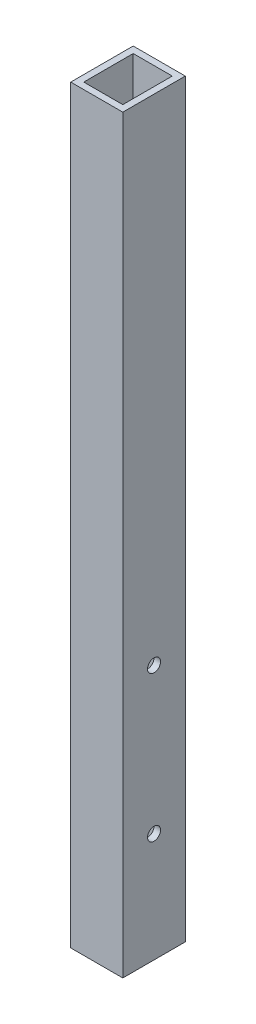
ISO-10303-21;
HEADER;
FILE_DESCRIPTION(('STEP AP214'),'2;1');
FILE_NAME('part.step','',(''),(''),'','','');
FILE_SCHEMA(('AUTOMOTIVE_DESIGN { 1 0 10303 214 1 1 1 1 }'));
ENDSEC;
DATA;
#1=APPLICATION_CONTEXT('core data for automotive mechanical design processes');
#2=APPLICATION_PROTOCOL_DEFINITION('international standard','automotive_design',2000,#1);
#3=PRODUCT_CONTEXT('',#1,'mechanical');
#4=PRODUCT('Part','Part','',(#3));
#5=PRODUCT_RELATED_PRODUCT_CATEGORY('part','',(#4));
#6=PRODUCT_DEFINITION_FORMATION('','',#4);
#7=PRODUCT_DEFINITION_CONTEXT('part definition',#1,'design');
#8=PRODUCT_DEFINITION('design','',#6,#7);
#9=PRODUCT_DEFINITION_SHAPE('','',#8);
#10=(LENGTH_UNIT() NAMED_UNIT(*) SI_UNIT(.MILLI.,.METRE.));
#11=(NAMED_UNIT(*) PLANE_ANGLE_UNIT() SI_UNIT($,.RADIAN.));
#12=(NAMED_UNIT(*) SI_UNIT($,.STERADIAN.) SOLID_ANGLE_UNIT());
#13=UNCERTAINTY_MEASURE_WITH_UNIT(LENGTH_MEASURE(1.E-05),#10,'distance_accuracy_value','');
#14=(GEOMETRIC_REPRESENTATION_CONTEXT(3) GLOBAL_UNCERTAINTY_ASSIGNED_CONTEXT((#13)) GLOBAL_UNIT_ASSIGNED_CONTEXT((#10,
#11,#12)) REPRESENTATION_CONTEXT('',''));
#15=CARTESIAN_POINT('',(0.,0.,0.));
#16=DIRECTION('',(0.,0.,1.));
#17=DIRECTION('',(1.,0.,0.));
#18=AXIS2_PLACEMENT_3D('',#15,#16,#17);
#19=CARTESIAN_POINT('',(31.75,914.4,38.1));
#20=DIRECTION('',(-1.,0.,0.));
#21=DIRECTION('',(0.,0.,1.));
#22=AXIS2_PLACEMENT_3D('',#19,#20,#21);
#23=PLANE('',#22);
#24=CARTESIAN_POINT('',(31.75,311.15,0.));
#25=DIRECTION('',(1.,0.,0.));
#26=DIRECTION('',(0.,0.,-1.));
#27=AXIS2_PLACEMENT_3D('',#24,#25,#26);
#28=CIRCLE('',#27,7.93749999999999);
#29=CARTESIAN_POINT('',(31.75,311.15,-7.93749999999999));
#30=VERTEX_POINT('',#29);
#31=EDGE_CURVE('E206',#30,#30,#28,.T.);
#32=ORIENTED_EDGE('',*,*,#31,.F.);
#33=EDGE_LOOP('',(#32));
#34=FACE_BOUND('',#33,.T.);
#35=CARTESIAN_POINT('',(31.75,133.35,0.));
#36=DIRECTION('',(1.,0.,0.));
#37=DIRECTION('',(0.,0.,-1.));
#38=AXIS2_PLACEMENT_3D('',#35,#36,#37);
#39=CIRCLE('',#38,7.93749999999999);
#40=CARTESIAN_POINT('',(31.75,133.35,-7.93749999999999));
#41=VERTEX_POINT('',#40);
#42=EDGE_CURVE('E218',#41,#41,#39,.T.);
#43=ORIENTED_EDGE('',*,*,#42,.F.);
#44=EDGE_LOOP('',(#43));
#45=FACE_BOUND('',#44,.T.);
#46=DIRECTION('',(0.,0.,-1.));
#47=VECTOR('',#46,1.);
#48=CARTESIAN_POINT('',(31.75,0.,38.1));
#49=LINE('',#48,#47);
#50=CARTESIAN_POINT('',(31.75,0.,38.1));
#51=VERTEX_POINT('',#50);
#52=CARTESIAN_POINT('',(31.75,0.,-38.1));
#53=VERTEX_POINT('',#52);
#54=EDGE_CURVE('E154',#51,#53,#49,.T.);
#55=ORIENTED_EDGE('',*,*,#54,.T.);
#56=DIRECTION('',(0.,-1.,0.));
#57=VECTOR('',#56,1.);
#58=CARTESIAN_POINT('',(31.75,914.4,-38.1));
#59=LINE('',#58,#57);
#60=CARTESIAN_POINT('',(31.75,914.4,-38.1));
#61=VERTEX_POINT('',#60);
#62=EDGE_CURVE('E11',#61,#53,#59,.T.);
#63=ORIENTED_EDGE('',*,*,#62,.F.);
#64=DIRECTION('',(0.,0.,-1.));
#65=VECTOR('',#64,1.);
#66=CARTESIAN_POINT('',(31.75,914.4,38.1));
#67=LINE('',#66,#65);
#68=CARTESIAN_POINT('',(31.75,914.4,38.1));
#69=VERTEX_POINT('',#68);
#70=EDGE_CURVE('E160',#69,#61,#67,.T.);
#71=ORIENTED_EDGE('',*,*,#70,.F.);
#72=DIRECTION('',(0.,-1.,0.));
#73=VECTOR('',#72,1.);
#74=CARTESIAN_POINT('',(31.75,914.4,38.1));
#75=LINE('',#74,#73);
#76=EDGE_CURVE('E174',#69,#51,#75,.T.);
#77=ORIENTED_EDGE('',*,*,#76,.T.);
#78=EDGE_LOOP('',(#55,#63,#71,#77));
#79=FACE_BOUND('',#78,.T.);
#80=ADVANCED_FACE('F41',(#34,#45,#79),#23,.F.);
#81=CARTESIAN_POINT('',(-31.75,914.4,-38.1));
#82=DIRECTION('',(0.,0.,1.));
#83=DIRECTION('',(1.,0.,0.));
#84=AXIS2_PLACEMENT_3D('',#81,#82,#83);
#85=PLANE('',#84);
#86=DIRECTION('',(-1.,0.,0.));
#87=VECTOR('',#86,1.);
#88=CARTESIAN_POINT('',(-31.75,0.,-38.1));
#89=LINE('',#88,#87);
#90=CARTESIAN_POINT('',(-31.75,0.,-38.1));
#91=VERTEX_POINT('',#90);
#92=EDGE_CURVE('E178',#53,#91,#89,.T.);
#93=ORIENTED_EDGE('',*,*,#92,.T.);
#94=DIRECTION('',(0.,-1.,0.));
#95=VECTOR('',#94,1.);
#96=CARTESIAN_POINT('',(-31.75,914.4,-38.1));
#97=LINE('',#96,#95);
#98=CARTESIAN_POINT('',(-31.75,914.4,-38.1));
#99=VERTEX_POINT('',#98);
#100=EDGE_CURVE('E50',#99,#91,#97,.T.);
#101=ORIENTED_EDGE('',*,*,#100,.F.);
#102=DIRECTION('',(-1.,0.,0.));
#103=VECTOR('',#102,1.);
#104=CARTESIAN_POINT('',(-31.75,914.4,-38.1));
#105=LINE('',#104,#103);
#106=EDGE_CURVE('E164',#61,#99,#105,.T.);
#107=ORIENTED_EDGE('',*,*,#106,.F.);
#108=ORIENTED_EDGE('',*,*,#62,.T.);
#109=EDGE_LOOP('',(#93,#101,#107,#108));
#110=FACE_BOUND('',#109,.T.);
#111=ADVANCED_FACE('F228',(#110),#85,.F.);
#112=CARTESIAN_POINT('',(-31.75,914.4,38.1));
#113=DIRECTION('',(1.,0.,0.));
#114=DIRECTION('',(0.,0.,-1.));
#115=AXIS2_PLACEMENT_3D('',#112,#113,#114);
#116=PLANE('',#115);
#117=CARTESIAN_POINT('',(-31.75,311.15,0.));
#118=DIRECTION('',(1.,0.,0.));
#119=DIRECTION('',(0.,0.,-1.));
#120=AXIS2_PLACEMENT_3D('',#117,#118,#119);
#121=CIRCLE('',#120,7.93749999999999);
#122=CARTESIAN_POINT('',(-31.75,311.15,-7.93749999999999));
#123=VERTEX_POINT('',#122);
#124=EDGE_CURVE('E199',#123,#123,#121,.T.);
#125=ORIENTED_EDGE('',*,*,#124,.T.);
#126=EDGE_LOOP('',(#125));
#127=FACE_BOUND('',#126,.T.);
#128=CARTESIAN_POINT('',(-31.75,133.35,0.));
#129=DIRECTION('',(1.,0.,0.));
#130=DIRECTION('',(0.,0.,-1.));
#131=AXIS2_PLACEMENT_3D('',#128,#129,#130);
#132=CIRCLE('',#131,7.93749999999999);
#133=CARTESIAN_POINT('',(-31.75,133.35,-7.93749999999999));
#134=VERTEX_POINT('',#133);
#135=EDGE_CURVE('E212',#134,#134,#132,.T.);
#136=ORIENTED_EDGE('',*,*,#135,.T.);
#137=EDGE_LOOP('',(#136));
#138=FACE_BOUND('',#137,.T.);
#139=DIRECTION('',(0.,0.,1.));
#140=VECTOR('',#139,1.);
#141=CARTESIAN_POINT('',(-31.75,0.,38.1));
#142=LINE('',#141,#140);
#143=CARTESIAN_POINT('',(-31.75,0.,38.1));
#144=VERTEX_POINT('',#143);
#145=EDGE_CURVE('E181',#91,#144,#142,.T.);
#146=ORIENTED_EDGE('',*,*,#145,.T.);
#147=DIRECTION('',(0.,-1.,0.));
#148=VECTOR('',#147,1.);
#149=CARTESIAN_POINT('',(-31.75,914.4,38.1));
#150=LINE('',#149,#148);
#151=CARTESIAN_POINT('',(-31.75,914.4,38.1));
#152=VERTEX_POINT('',#151);
#153=EDGE_CURVE('E189',#152,#144,#150,.T.);
#154=ORIENTED_EDGE('',*,*,#153,.F.);
#155=DIRECTION('',(0.,0.,1.));
#156=VECTOR('',#155,1.);
#157=CARTESIAN_POINT('',(-31.75,914.4,38.1));
#158=LINE('',#157,#156);
#159=EDGE_CURVE('E168',#99,#152,#158,.T.);
#160=ORIENTED_EDGE('',*,*,#159,.F.);
#161=ORIENTED_EDGE('',*,*,#100,.T.);
#162=EDGE_LOOP('',(#146,#154,#160,#161));
#163=FACE_BOUND('',#162,.T.);
#164=ADVANCED_FACE('F246',(#127,#138,#163),#116,.F.);
#165=CARTESIAN_POINT('',(-31.75,914.4,38.1));
#166=DIRECTION('',(0.,0.,-1.));
#167=DIRECTION('',(-1.,0.,0.));
#168=AXIS2_PLACEMENT_3D('',#165,#166,#167);
#169=PLANE('',#168);
#170=DIRECTION('',(1.,0.,0.));
#171=VECTOR('',#170,1.);
#172=CARTESIAN_POINT('',(-31.75,0.,38.1));
#173=LINE('',#172,#171);
#174=EDGE_CURVE('E165',#144,#51,#173,.T.);
#175=ORIENTED_EDGE('',*,*,#174,.T.);
#176=ORIENTED_EDGE('',*,*,#76,.F.);
#177=DIRECTION('',(1.,0.,0.));
#178=VECTOR('',#177,1.);
#179=CARTESIAN_POINT('',(-31.75,914.4,38.1));
#180=LINE('',#179,#178);
#181=EDGE_CURVE('E171',#152,#69,#180,.T.);
#182=ORIENTED_EDGE('',*,*,#181,.F.);
#183=ORIENTED_EDGE('',*,*,#153,.T.);
#184=EDGE_LOOP('',(#175,#176,#182,#183));
#185=FACE_BOUND('',#184,.T.);
#186=ADVANCED_FACE('F244',(#185),#169,.F.);
#187=CARTESIAN_POINT('',(0.,914.4,0.));
#188=DIRECTION('',(0.,-1.,0.));
#189=DIRECTION('',(0.,0.,-1.));
#190=AXIS2_PLACEMENT_3D('',#187,#188,#189);
#191=PLANE('',#190);
#192=DIRECTION('',(-1.,0.,0.));
#193=VECTOR('',#192,1.);
#194=CARTESIAN_POINT('',(-23.8125,914.4,-30.1625));
#195=LINE('',#194,#193);
#196=CARTESIAN_POINT('',(23.8125,914.4,-30.1625));
#197=VERTEX_POINT('',#196);
#198=CARTESIAN_POINT('',(-23.8125,914.4,-30.1625));
#199=VERTEX_POINT('',#198);
#200=EDGE_CURVE('E145',#197,#199,#195,.T.);
#201=ORIENTED_EDGE('',*,*,#200,.F.);
#202=DIRECTION('',(0.,0.,-1.));
#203=VECTOR('',#202,1.);
#204=CARTESIAN_POINT('',(23.8125,914.4,30.1625));
#205=LINE('',#204,#203);
#206=CARTESIAN_POINT('',(23.8125,914.4,30.1625));
#207=VERTEX_POINT('',#206);
#208=EDGE_CURVE('E58',#207,#197,#205,.T.);
#209=ORIENTED_EDGE('',*,*,#208,.F.);
#210=DIRECTION('',(1.,0.,0.));
#211=VECTOR('',#210,1.);
#212=CARTESIAN_POINT('',(-23.8125,914.4,30.1625));
#213=LINE('',#212,#211);
#214=CARTESIAN_POINT('',(-23.8125,914.4,30.1625));
#215=VERTEX_POINT('',#214);
#216=EDGE_CURVE('E129',#215,#207,#213,.T.);
#217=ORIENTED_EDGE('',*,*,#216,.F.);
#218=DIRECTION('',(0.,0.,1.));
#219=VECTOR('',#218,1.);
#220=CARTESIAN_POINT('',(-23.8125,914.4,30.1625));
#221=LINE('',#220,#219);
#222=EDGE_CURVE('E133',#199,#215,#221,.T.);
#223=ORIENTED_EDGE('',*,*,#222,.F.);
#224=EDGE_LOOP('',(#201,#209,#217,#223));
#225=FACE_BOUND('',#224,.T.);
#226=ORIENTED_EDGE('',*,*,#70,.T.);
#227=ORIENTED_EDGE('',*,*,#106,.T.);
#228=ORIENTED_EDGE('',*,*,#159,.T.);
#229=ORIENTED_EDGE('',*,*,#181,.T.);
#230=EDGE_LOOP('',(#226,#227,#228,#229));
#231=FACE_BOUND('',#230,.T.);
#232=ADVANCED_FACE('F240',(#225,#231),#191,.F.);
#233=CARTESIAN_POINT('',(0.,0.,0.));
#234=DIRECTION('',(0.,-1.,0.));
#235=DIRECTION('',(0.,0.,-1.));
#236=AXIS2_PLACEMENT_3D('',#233,#234,#235);
#237=PLANE('',#236);
#238=DIRECTION('',(0.,0.,-1.));
#239=VECTOR('',#238,1.);
#240=CARTESIAN_POINT('',(23.8125,0.,30.1625));
#241=LINE('',#240,#239);
#242=CARTESIAN_POINT('',(23.8125,0.,30.1625));
#243=VERTEX_POINT('',#242);
#244=CARTESIAN_POINT('',(23.8125,0.,-30.1625));
#245=VERTEX_POINT('',#244);
#246=EDGE_CURVE('E110',#243,#245,#241,.T.);
#247=ORIENTED_EDGE('',*,*,#246,.T.);
#248=DIRECTION('',(-1.,0.,0.));
#249=VECTOR('',#248,1.);
#250=CARTESIAN_POINT('',(-23.8125,0.,-30.1625));
#251=LINE('',#250,#249);
#252=CARTESIAN_POINT('',(-23.8125,0.,-30.1625));
#253=VERTEX_POINT('',#252);
#254=EDGE_CURVE('E120',#245,#253,#251,.T.);
#255=ORIENTED_EDGE('',*,*,#254,.T.);
#256=DIRECTION('',(0.,0.,1.));
#257=VECTOR('',#256,1.);
#258=CARTESIAN_POINT('',(-23.8125,0.,30.1625));
#259=LINE('',#258,#257);
#260=CARTESIAN_POINT('',(-23.8125,0.,30.1625));
#261=VERTEX_POINT('',#260);
#262=EDGE_CURVE('E66',#253,#261,#259,.T.);
#263=ORIENTED_EDGE('',*,*,#262,.T.);
#264=DIRECTION('',(1.,0.,0.));
#265=VECTOR('',#264,1.);
#266=CARTESIAN_POINT('',(-23.8125,0.,30.1625));
#267=LINE('',#266,#265);
#268=EDGE_CURVE('E117',#261,#243,#267,.T.);
#269=ORIENTED_EDGE('',*,*,#268,.T.);
#270=EDGE_LOOP('',(#247,#255,#263,#269));
#271=FACE_BOUND('',#270,.T.);
#272=ORIENTED_EDGE('',*,*,#54,.F.);
#273=ORIENTED_EDGE('',*,*,#174,.F.);
#274=ORIENTED_EDGE('',*,*,#145,.F.);
#275=ORIENTED_EDGE('',*,*,#92,.F.);
#276=EDGE_LOOP('',(#272,#273,#274,#275));
#277=FACE_BOUND('',#276,.T.);
#278=ADVANCED_FACE('F125',(#271,#277),#237,.T.);
#279=CARTESIAN_POINT('',(23.8125,0.,30.1625));
#280=DIRECTION('',(1.,0.,0.));
#281=DIRECTION('',(0.,0.,-1.));
#282=AXIS2_PLACEMENT_3D('',#279,#280,#281);
#283=PLANE('',#282);
#284=CARTESIAN_POINT('',(23.8125,311.15,0.));
#285=DIRECTION('',(1.,0.,0.));
#286=DIRECTION('',(0.,0.,-1.));
#287=AXIS2_PLACEMENT_3D('',#284,#285,#286);
#288=CIRCLE('',#287,7.93749999999999);
#289=CARTESIAN_POINT('',(23.8125,311.15,-7.93749999999999));
#290=VERTEX_POINT('',#289);
#291=EDGE_CURVE('E136',#290,#290,#288,.T.);
#292=ORIENTED_EDGE('',*,*,#291,.T.);
#293=EDGE_LOOP('',(#292));
#294=FACE_BOUND('',#293,.T.);
#295=CARTESIAN_POINT('',(23.8125,133.35,0.));
#296=DIRECTION('',(1.,0.,0.));
#297=DIRECTION('',(0.,0.,-1.));
#298=AXIS2_PLACEMENT_3D('',#295,#296,#297);
#299=CIRCLE('',#298,7.93749999999999);
#300=CARTESIAN_POINT('',(23.8125,133.35,-7.93749999999999));
#301=VERTEX_POINT('',#300);
#302=EDGE_CURVE('E198',#301,#301,#299,.T.);
#303=ORIENTED_EDGE('',*,*,#302,.T.);
#304=EDGE_LOOP('',(#303));
#305=FACE_BOUND('',#304,.T.);
#306=ORIENTED_EDGE('',*,*,#208,.T.);
#307=DIRECTION('',(0.,1.,0.));
#308=VECTOR('',#307,1.);
#309=CARTESIAN_POINT('',(23.8125,0.,-30.1625));
#310=LINE('',#309,#308);
#311=EDGE_CURVE('E106',#245,#197,#310,.T.);
#312=ORIENTED_EDGE('',*,*,#311,.F.);
#313=ORIENTED_EDGE('',*,*,#246,.F.);
#314=DIRECTION('',(0.,1.,0.));
#315=VECTOR('',#314,1.);
#316=CARTESIAN_POINT('',(23.8125,0.,30.1625));
#317=LINE('',#316,#315);
#318=EDGE_CURVE('E151',#243,#207,#317,.T.);
#319=ORIENTED_EDGE('',*,*,#318,.T.);
#320=EDGE_LOOP('',(#306,#312,#313,#319));
#321=FACE_BOUND('',#320,.T.);
#322=ADVANCED_FACE('F108',(#294,#305,#321),#283,.F.);
#323=CARTESIAN_POINT('',(-23.8125,0.,30.1625));
#324=DIRECTION('',(0.,0.,1.));
#325=DIRECTION('',(1.,0.,0.));
#326=AXIS2_PLACEMENT_3D('',#323,#324,#325);
#327=PLANE('',#326);
#328=ORIENTED_EDGE('',*,*,#216,.T.);
#329=ORIENTED_EDGE('',*,*,#318,.F.);
#330=ORIENTED_EDGE('',*,*,#268,.F.);
#331=DIRECTION('',(0.,1.,0.));
#332=VECTOR('',#331,1.);
#333=CARTESIAN_POINT('',(-23.8125,0.,30.1625));
#334=LINE('',#333,#332);
#335=EDGE_CURVE('E155',#261,#215,#334,.T.);
#336=ORIENTED_EDGE('',*,*,#335,.T.);
#337=EDGE_LOOP('',(#328,#329,#330,#336));
#338=FACE_BOUND('',#337,.T.);
#339=ADVANCED_FACE('F263',(#338),#327,.F.);
#340=CARTESIAN_POINT('',(-23.8125,0.,30.1625));
#341=DIRECTION('',(-1.,0.,0.));
#342=DIRECTION('',(0.,0.,1.));
#343=AXIS2_PLACEMENT_3D('',#340,#341,#342);
#344=PLANE('',#343);
#345=CARTESIAN_POINT('',(-23.8125,311.15,0.));
#346=DIRECTION('',(-1.,0.,0.));
#347=DIRECTION('',(0.,0.,1.));
#348=AXIS2_PLACEMENT_3D('',#345,#346,#347);
#349=CIRCLE('',#348,7.93749999999999);
#350=CARTESIAN_POINT('',(-23.8125,311.15,7.93749999999999));
#351=VERTEX_POINT('',#350);
#352=EDGE_CURVE('E44',#351,#351,#349,.T.);
#353=ORIENTED_EDGE('',*,*,#352,.T.);
#354=EDGE_LOOP('',(#353));
#355=FACE_BOUND('',#354,.T.);
#356=CARTESIAN_POINT('',(-23.8125,133.35,0.));
#357=DIRECTION('',(-1.,0.,0.));
#358=DIRECTION('',(0.,0.,1.));
#359=AXIS2_PLACEMENT_3D('',#356,#357,#358);
#360=CIRCLE('',#359,7.93749999999999);
#361=CARTESIAN_POINT('',(-23.8125,133.35,7.93749999999999));
#362=VERTEX_POINT('',#361);
#363=EDGE_CURVE('E195',#362,#362,#360,.T.);
#364=ORIENTED_EDGE('',*,*,#363,.T.);
#365=EDGE_LOOP('',(#364));
#366=FACE_BOUND('',#365,.T.);
#367=ORIENTED_EDGE('',*,*,#222,.T.);
#368=ORIENTED_EDGE('',*,*,#335,.F.);
#369=ORIENTED_EDGE('',*,*,#262,.F.);
#370=DIRECTION('',(0.,1.,0.));
#371=VECTOR('',#370,1.);
#372=CARTESIAN_POINT('',(-23.8125,0.,-30.1625));
#373=LINE('',#372,#371);
#374=EDGE_CURVE('E116',#253,#199,#373,.T.);
#375=ORIENTED_EDGE('',*,*,#374,.T.);
#376=EDGE_LOOP('',(#367,#368,#369,#375));
#377=FACE_BOUND('',#376,.T.);
#378=ADVANCED_FACE('F268',(#355,#366,#377),#344,.F.);
#379=CARTESIAN_POINT('',(-23.8125,0.,-30.1625));
#380=DIRECTION('',(0.,0.,-1.));
#381=DIRECTION('',(-1.,0.,0.));
#382=AXIS2_PLACEMENT_3D('',#379,#380,#381);
#383=PLANE('',#382);
#384=ORIENTED_EDGE('',*,*,#200,.T.);
#385=ORIENTED_EDGE('',*,*,#374,.F.);
#386=ORIENTED_EDGE('',*,*,#254,.F.);
#387=ORIENTED_EDGE('',*,*,#311,.T.);
#388=EDGE_LOOP('',(#384,#385,#386,#387));
#389=FACE_BOUND('',#388,.T.);
#390=ADVANCED_FACE('F121',(#389),#383,.F.);
#391=CARTESIAN_POINT('',(-31.75,133.35,0.));
#392=DIRECTION('',(1.,0.,0.));
#393=DIRECTION('',(0.,0.,-1.));
#394=AXIS2_PLACEMENT_3D('',#391,#392,#393);
#395=CYLINDRICAL_SURFACE('',#394,7.93749999999999);
#396=ORIENTED_EDGE('',*,*,#135,.F.);
#397=EDGE_LOOP('',(#396));
#398=FACE_BOUND('',#397,.T.);
#399=ORIENTED_EDGE('',*,*,#363,.F.);
#400=EDGE_LOOP('',(#399));
#401=FACE_BOUND('',#400,.T.);
#402=ADVANCED_FACE('F267',(#398,#401),#395,.F.);
#403=CARTESIAN_POINT('',(-31.75,311.15,0.));
#404=DIRECTION('',(1.,0.,0.));
#405=DIRECTION('',(0.,0.,-1.));
#406=AXIS2_PLACEMENT_3D('',#403,#404,#405);
#407=CYLINDRICAL_SURFACE('',#406,7.93749999999999);
#408=ORIENTED_EDGE('',*,*,#124,.F.);
#409=EDGE_LOOP('',(#408));
#410=FACE_BOUND('',#409,.T.);
#411=ORIENTED_EDGE('',*,*,#352,.F.);
#412=EDGE_LOOP('',(#411));
#413=FACE_BOUND('',#412,.T.);
#414=ADVANCED_FACE('F278',(#410,#413),#407,.F.);
#415=ORIENTED_EDGE('',*,*,#42,.T.);
#416=EDGE_LOOP('',(#415));
#417=FACE_BOUND('',#416,.T.);
#418=ORIENTED_EDGE('',*,*,#302,.F.);
#419=EDGE_LOOP('',(#418));
#420=FACE_BOUND('',#419,.T.);
#421=ADVANCED_FACE('F223',(#417,#420),#395,.F.);
#422=ORIENTED_EDGE('',*,*,#31,.T.);
#423=EDGE_LOOP('',(#422));
#424=FACE_BOUND('',#423,.T.);
#425=ORIENTED_EDGE('',*,*,#291,.F.);
#426=EDGE_LOOP('',(#425));
#427=FACE_BOUND('',#426,.T.);
#428=ADVANCED_FACE('F277',(#424,#427),#407,.F.);
#429=CLOSED_SHELL('',(#80,#111,#164,#186,#232,#278,#322,#339,#378,#390,#402,#414,#421,#428));
#430=MANIFOLD_SOLID_BREP('B2',#429);
#431=ADVANCED_BREP_SHAPE_REPRESENTATION('',(#18,#430),#14);
#432=SHAPE_DEFINITION_REPRESENTATION(#9,#431);
ENDSEC;
END-ISO-10303-21;
